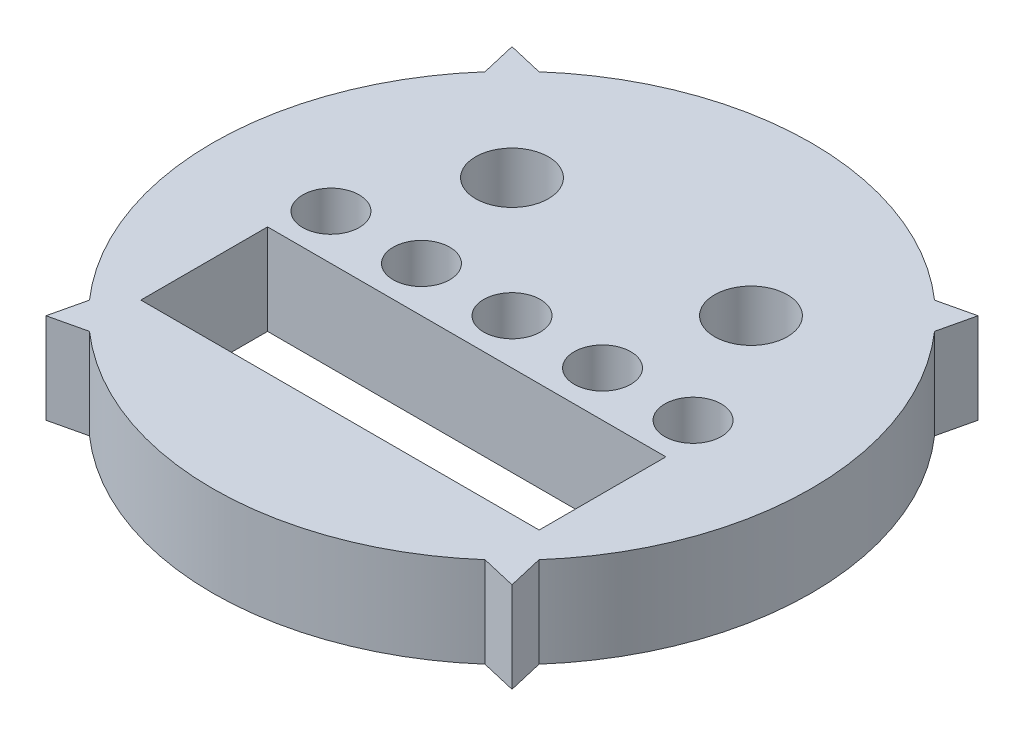
ISO-10303-21;
HEADER;
FILE_DESCRIPTION(('STEP AP214'),'2;1');
FILE_NAME('part.step','',(''),(''),'','','');
FILE_SCHEMA(('AUTOMOTIVE_DESIGN { 1 0 10303 214 1 1 1 1 }'));
ENDSEC;
DATA;
#1=APPLICATION_CONTEXT('core data for automotive mechanical design processes');
#2=APPLICATION_PROTOCOL_DEFINITION('international standard','automotive_design',2000,#1);
#3=PRODUCT_CONTEXT('',#1,'mechanical');
#4=PRODUCT('Part','Part','',(#3));
#5=PRODUCT_RELATED_PRODUCT_CATEGORY('part','',(#4));
#6=PRODUCT_DEFINITION_FORMATION('','',#4);
#7=PRODUCT_DEFINITION_CONTEXT('part definition',#1,'design');
#8=PRODUCT_DEFINITION('design','',#6,#7);
#9=PRODUCT_DEFINITION_SHAPE('','',#8);
#10=(LENGTH_UNIT() NAMED_UNIT(*) SI_UNIT(.MILLI.,.METRE.));
#11=(NAMED_UNIT(*) PLANE_ANGLE_UNIT() SI_UNIT($,.RADIAN.));
#12=(NAMED_UNIT(*) SI_UNIT($,.STERADIAN.) SOLID_ANGLE_UNIT());
#13=UNCERTAINTY_MEASURE_WITH_UNIT(LENGTH_MEASURE(1.E-05),#10,'distance_accuracy_value','');
#14=(GEOMETRIC_REPRESENTATION_CONTEXT(3) GLOBAL_UNCERTAINTY_ASSIGNED_CONTEXT((#13)) GLOBAL_UNIT_ASSIGNED_CONTEXT((#10,
#11,#12)) REPRESENTATION_CONTEXT('',''));
#15=CARTESIAN_POINT('',(0.,0.,0.));
#16=DIRECTION('',(0.,0.,1.));
#17=DIRECTION('',(1.,0.,0.));
#18=AXIS2_PLACEMENT_3D('',#15,#16,#17);
#19=CARTESIAN_POINT('',(0.,6.35,0.));
#20=DIRECTION('',(0.,1.,0.));
#21=DIRECTION('',(0.,0.,1.));
#22=AXIS2_PLACEMENT_3D('',#19,#20,#21);
#23=PLANE('',#22);
#24=CARTESIAN_POINT('',(8.382,6.35,-8.382));
#25=DIRECTION('',(0.,1.,0.));
#26=DIRECTION('',(0.,0.,1.));
#27=AXIS2_PLACEMENT_3D('',#24,#25,#26);
#28=CIRCLE('',#27,2.5527);
#29=CARTESIAN_POINT('',(8.382,6.35,-5.8293));
#30=VERTEX_POINT('',#29);
#31=EDGE_CURVE('E472',#30,#30,#28,.T.);
#32=ORIENTED_EDGE('',*,*,#31,.F.);
#33=EDGE_LOOP('',(#32));
#34=FACE_BOUND('',#33,.T.);
#35=CARTESIAN_POINT('',(-8.382,6.35,-8.382));
#36=DIRECTION('',(0.,1.,0.));
#37=DIRECTION('',(0.,0.,1.));
#38=AXIS2_PLACEMENT_3D('',#35,#36,#37);
#39=CIRCLE('',#38,2.5527);
#40=CARTESIAN_POINT('',(-8.382,6.35,-5.8293));
#41=VERTEX_POINT('',#40);
#42=EDGE_CURVE('E182',#41,#41,#39,.T.);
#43=ORIENTED_EDGE('',*,*,#42,.F.);
#44=EDGE_LOOP('',(#43));
#45=FACE_BOUND('',#44,.T.);
#46=CARTESIAN_POINT('',(-6.35,6.35,0.));
#47=DIRECTION('',(0.,1.,0.));
#48=DIRECTION('',(0.,0.,1.));
#49=AXIS2_PLACEMENT_3D('',#46,#47,#48);
#50=CIRCLE('',#49,1.984375);
#51=CARTESIAN_POINT('',(-6.35,6.35,1.984375));
#52=VERTEX_POINT('',#51);
#53=EDGE_CURVE('E213',#52,#52,#50,.T.);
#54=ORIENTED_EDGE('',*,*,#53,.F.);
#55=EDGE_LOOP('',(#54));
#56=FACE_BOUND('',#55,.T.);
#57=CARTESIAN_POINT('',(0.,6.35,0.));
#58=DIRECTION('',(0.,1.,0.));
#59=DIRECTION('',(0.,0.,1.));
#60=AXIS2_PLACEMENT_3D('',#57,#58,#59);
#61=CIRCLE('',#60,21.);
#62=CARTESIAN_POINT('',(13.8700852365894,6.35,-15.767711803865));
#63=VERTEX_POINT('',#62);
#64=CARTESIAN_POINT('',(-13.8700852365893,6.35,-15.7677118038652));
#65=VERTEX_POINT('',#64);
#66=EDGE_CURVE('E232',#63,#65,#61,.T.);
#67=ORIENTED_EDGE('',*,*,#66,.T.);
#68=DIRECTION('',(-0.973932989200464,0.,-0.22683591546986));
#69=VECTOR('',#68,1.);
#70=CARTESIAN_POINT('',(-16.3438750291584,6.35,-16.3438750291586));
#71=LINE('',#70,#69);
#72=CARTESIAN_POINT('',(-16.3438750291584,6.35,-16.3438750291586));
#73=VERTEX_POINT('',#72);
#74=EDGE_CURVE('E235',#65,#73,#71,.T.);
#75=ORIENTED_EDGE('',*,*,#74,.T.);
#76=DIRECTION('',(0.22683591546985,0.,0.973932989200466));
#77=VECTOR('',#76,1.);
#78=CARTESIAN_POINT('',(-15.767711803865,6.35,-13.8700852365894));
#79=LINE('',#78,#77);
#80=CARTESIAN_POINT('',(-15.767711803865,6.35,-13.8700852365894));
#81=VERTEX_POINT('',#80);
#82=EDGE_CURVE('E238',#73,#81,#79,.T.);
#83=ORIENTED_EDGE('',*,*,#82,.T.);
#84=CARTESIAN_POINT('',(0.,6.35,0.));
#85=DIRECTION('',(0.,1.,0.));
#86=DIRECTION('',(0.,0.,1.));
#87=AXIS2_PLACEMENT_3D('',#84,#85,#86);
#88=CIRCLE('',#87,21.);
#89=CARTESIAN_POINT('',(-15.7677118038652,6.35,13.8700852365893));
#90=VERTEX_POINT('',#89);
#91=EDGE_CURVE('E240',#81,#90,#88,.T.);
#92=ORIENTED_EDGE('',*,*,#91,.T.);
#93=DIRECTION('',(-0.226835915469858,0.,0.973932989200464));
#94=VECTOR('',#93,1.);
#95=CARTESIAN_POINT('',(-16.3438750291586,6.35,16.3438750291584));
#96=LINE('',#95,#94);
#97=CARTESIAN_POINT('',(-16.3438750291586,6.35,16.3438750291584));
#98=VERTEX_POINT('',#97);
#99=EDGE_CURVE('E242',#90,#98,#96,.T.);
#100=ORIENTED_EDGE('',*,*,#99,.T.);
#101=DIRECTION('',(0.973932989200466,0.,-0.22683591546985));
#102=VECTOR('',#101,1.);
#103=CARTESIAN_POINT('',(-13.8700852365894,6.35,15.767711803865));
#104=LINE('',#103,#102);
#105=CARTESIAN_POINT('',(-13.8700852365894,6.35,15.767711803865));
#106=VERTEX_POINT('',#105);
#107=EDGE_CURVE('E244',#98,#106,#104,.T.);
#108=ORIENTED_EDGE('',*,*,#107,.T.);
#109=CARTESIAN_POINT('',(0.,6.35,0.));
#110=DIRECTION('',(0.,1.,0.));
#111=DIRECTION('',(0.,0.,1.));
#112=AXIS2_PLACEMENT_3D('',#109,#110,#111);
#113=CIRCLE('',#112,21.);
#114=CARTESIAN_POINT('',(13.8700852365893,6.35,15.7677118038652));
#115=VERTEX_POINT('',#114);
#116=EDGE_CURVE('E246',#106,#115,#113,.T.);
#117=ORIENTED_EDGE('',*,*,#116,.T.);
#118=DIRECTION('',(0.973932989200464,0.,0.226835915469859));
#119=VECTOR('',#118,1.);
#120=CARTESIAN_POINT('',(16.3438750291584,6.35,16.3438750291586));
#121=LINE('',#120,#119);
#122=CARTESIAN_POINT('',(16.3438750291584,6.35,16.3438750291586));
#123=VERTEX_POINT('',#122);
#124=EDGE_CURVE('E248',#115,#123,#121,.T.);
#125=ORIENTED_EDGE('',*,*,#124,.T.);
#126=DIRECTION('',(-0.226835915469849,0.,-0.973932989200466));
#127=VECTOR('',#126,1.);
#128=CARTESIAN_POINT('',(15.767711803865,6.35,13.8700852365894));
#129=LINE('',#128,#127);
#130=CARTESIAN_POINT('',(15.767711803865,6.35,13.8700852365894));
#131=VERTEX_POINT('',#130);
#132=EDGE_CURVE('E250',#123,#131,#129,.T.);
#133=ORIENTED_EDGE('',*,*,#132,.T.);
#134=CARTESIAN_POINT('',(0.,6.35,0.));
#135=DIRECTION('',(0.,1.,0.));
#136=DIRECTION('',(0.,0.,1.));
#137=AXIS2_PLACEMENT_3D('',#134,#135,#136);
#138=CIRCLE('',#137,21.);
#139=CARTESIAN_POINT('',(15.7677118038652,6.35,-13.8700852365893));
#140=VERTEX_POINT('',#139);
#141=EDGE_CURVE('E252',#131,#140,#138,.T.);
#142=ORIENTED_EDGE('',*,*,#141,.T.);
#143=DIRECTION('',(0.226835915469859,0.,-0.973932989200464));
#144=VECTOR('',#143,1.);
#145=CARTESIAN_POINT('',(16.3438750291586,6.35,-16.3438750291584));
#146=LINE('',#145,#144);
#147=CARTESIAN_POINT('',(16.3438750291586,6.35,-16.3438750291584));
#148=VERTEX_POINT('',#147);
#149=EDGE_CURVE('E254',#140,#148,#146,.T.);
#150=ORIENTED_EDGE('',*,*,#149,.T.);
#151=DIRECTION('',(-0.973932989200466,0.,0.226835915469849));
#152=VECTOR('',#151,1.);
#153=CARTESIAN_POINT('',(13.8700852365894,6.35,-15.767711803865));
#154=LINE('',#153,#152);
#155=EDGE_CURVE('E256',#148,#63,#154,.T.);
#156=ORIENTED_EDGE('',*,*,#155,.T.);
#157=EDGE_LOOP('',(#67,#75,#83,#92,#100,#108,#117,#125,#133,#142,#150,#156));
#158=FACE_BOUND('',#157,.T.);
#159=CARTESIAN_POINT('',(-12.7,6.35,0.));
#160=DIRECTION('',(0.,1.,0.));
#161=DIRECTION('',(0.,0.,1.));
#162=AXIS2_PLACEMENT_3D('',#159,#160,#161);
#163=CIRCLE('',#162,1.984375);
#164=CARTESIAN_POINT('',(-12.7,6.35,1.984375));
#165=VERTEX_POINT('',#164);
#166=EDGE_CURVE('E224',#165,#165,#163,.T.);
#167=ORIENTED_EDGE('',*,*,#166,.F.);
#168=EDGE_LOOP('',(#167));
#169=FACE_BOUND('',#168,.T.);
#170=CARTESIAN_POINT('',(0.,6.35,0.));
#171=DIRECTION('',(0.,1.,0.));
#172=DIRECTION('',(0.,0.,1.));
#173=AXIS2_PLACEMENT_3D('',#170,#171,#172);
#174=CIRCLE('',#173,1.984375);
#175=CARTESIAN_POINT('',(0.,6.35,1.984375));
#176=VERTEX_POINT('',#175);
#177=EDGE_CURVE('E205',#176,#176,#174,.T.);
#178=ORIENTED_EDGE('',*,*,#177,.F.);
#179=EDGE_LOOP('',(#178));
#180=FACE_BOUND('',#179,.T.);
#181=DIRECTION('',(1.,0.,0.));
#182=VECTOR('',#181,1.);
#183=CARTESIAN_POINT('',(-13.97,6.35,12.065));
#184=LINE('',#183,#182);
#185=CARTESIAN_POINT('',(-13.97,6.35,12.065));
#186=VERTEX_POINT('',#185);
#187=CARTESIAN_POINT('',(13.97,6.35,12.065));
#188=VERTEX_POINT('',#187);
#189=EDGE_CURVE('E159',#186,#188,#184,.T.);
#190=ORIENTED_EDGE('',*,*,#189,.F.);
#191=DIRECTION('',(0.,0.,1.));
#192=VECTOR('',#191,1.);
#193=CARTESIAN_POINT('',(-13.97,6.35,3.175));
#194=LINE('',#193,#192);
#195=CARTESIAN_POINT('',(-13.97,6.35,3.175));
#196=VERTEX_POINT('',#195);
#197=EDGE_CURVE('E151',#196,#186,#194,.T.);
#198=ORIENTED_EDGE('',*,*,#197,.F.);
#199=DIRECTION('',(-1.,0.,0.));
#200=VECTOR('',#199,1.);
#201=CARTESIAN_POINT('',(-13.97,6.35,3.175));
#202=LINE('',#201,#200);
#203=CARTESIAN_POINT('',(13.97,6.35,3.175));
#204=VERTEX_POINT('',#203);
#205=EDGE_CURVE('E174',#204,#196,#202,.T.);
#206=ORIENTED_EDGE('',*,*,#205,.F.);
#207=DIRECTION('',(0.,0.,-1.));
#208=VECTOR('',#207,1.);
#209=CARTESIAN_POINT('',(13.97,6.35,3.175));
#210=LINE('',#209,#208);
#211=EDGE_CURVE('E172',#188,#204,#210,.T.);
#212=ORIENTED_EDGE('',*,*,#211,.F.);
#213=EDGE_LOOP('',(#190,#198,#206,#212));
#214=FACE_BOUND('',#213,.T.);
#215=CARTESIAN_POINT('',(6.35,6.35,0.));
#216=DIRECTION('',(0.,1.,0.));
#217=DIRECTION('',(0.,0.,1.));
#218=AXIS2_PLACEMENT_3D('',#215,#216,#217);
#219=CIRCLE('',#218,1.984375);
#220=CARTESIAN_POINT('',(6.35,6.35,1.984375));
#221=VERTEX_POINT('',#220);
#222=EDGE_CURVE('E479',#221,#221,#219,.T.);
#223=ORIENTED_EDGE('',*,*,#222,.F.);
#224=EDGE_LOOP('',(#223));
#225=FACE_BOUND('',#224,.T.);
#226=CARTESIAN_POINT('',(12.7,6.35,0.));
#227=DIRECTION('',(0.,1.,0.));
#228=DIRECTION('',(0.,0.,1.));
#229=AXIS2_PLACEMENT_3D('',#226,#227,#228);
#230=CIRCLE('',#229,1.984375);
#231=CARTESIAN_POINT('',(12.7,6.35,1.984375));
#232=VERTEX_POINT('',#231);
#233=EDGE_CURVE('E461',#232,#232,#230,.T.);
#234=ORIENTED_EDGE('',*,*,#233,.F.);
#235=EDGE_LOOP('',(#234));
#236=FACE_BOUND('',#235,.T.);
#237=ADVANCED_FACE('F38',(#34,#45,#56,#158,#169,#180,#214,#225,#236),#23,.T.);
#238=CARTESIAN_POINT('',(0.,0.,0.));
#239=DIRECTION('',(0.,1.,0.));
#240=DIRECTION('',(0.,0.,1.));
#241=AXIS2_PLACEMENT_3D('',#238,#239,#240);
#242=PLANE('',#241);
#243=CARTESIAN_POINT('',(0.,0.,0.));
#244=DIRECTION('',(0.,1.,0.));
#245=DIRECTION('',(0.,0.,1.));
#246=AXIS2_PLACEMENT_3D('',#243,#244,#245);
#247=CIRCLE('',#246,1.984375);
#248=CARTESIAN_POINT('',(0.,0.,1.984375));
#249=VERTEX_POINT('',#248);
#250=EDGE_CURVE('E167',#249,#249,#247,.T.);
#251=ORIENTED_EDGE('',*,*,#250,.T.);
#252=EDGE_LOOP('',(#251));
#253=FACE_BOUND('',#252,.T.);
#254=CARTESIAN_POINT('',(-6.35,0.,0.));
#255=DIRECTION('',(0.,1.,0.));
#256=DIRECTION('',(0.,0.,1.));
#257=AXIS2_PLACEMENT_3D('',#254,#255,#256);
#258=CIRCLE('',#257,1.984375);
#259=CARTESIAN_POINT('',(-6.35,0.,1.984375));
#260=VERTEX_POINT('',#259);
#261=EDGE_CURVE('E208',#260,#260,#258,.T.);
#262=ORIENTED_EDGE('',*,*,#261,.T.);
#263=EDGE_LOOP('',(#262));
#264=FACE_BOUND('',#263,.T.);
#265=CARTESIAN_POINT('',(-12.7,0.,0.));
#266=DIRECTION('',(0.,1.,0.));
#267=DIRECTION('',(0.,0.,1.));
#268=AXIS2_PLACEMENT_3D('',#265,#266,#267);
#269=CIRCLE('',#268,1.984375);
#270=CARTESIAN_POINT('',(-12.7,0.,1.984375));
#271=VERTEX_POINT('',#270);
#272=EDGE_CURVE('E227',#271,#271,#269,.T.);
#273=ORIENTED_EDGE('',*,*,#272,.T.);
#274=EDGE_LOOP('',(#273));
#275=FACE_BOUND('',#274,.T.);
#276=CARTESIAN_POINT('',(0.,0.,0.));
#277=DIRECTION('',(0.,1.,0.));
#278=DIRECTION('',(0.,0.,1.));
#279=AXIS2_PLACEMENT_3D('',#276,#277,#278);
#280=CIRCLE('',#279,21.);
#281=CARTESIAN_POINT('',(13.8700852365894,0.,-15.767711803865));
#282=VERTEX_POINT('',#281);
#283=CARTESIAN_POINT('',(-13.8700852365893,0.,-15.7677118038652));
#284=VERTEX_POINT('',#283);
#285=EDGE_CURVE('E226',#282,#284,#280,.T.);
#286=ORIENTED_EDGE('',*,*,#285,.F.);
#287=DIRECTION('',(-0.973932989200466,0.,0.226835915469849));
#288=VECTOR('',#287,1.);
#289=CARTESIAN_POINT('',(13.8700852365894,0.,-15.767711803865));
#290=LINE('',#289,#288);
#291=CARTESIAN_POINT('',(16.3438750291586,0.,-16.3438750291584));
#292=VERTEX_POINT('',#291);
#293=EDGE_CURVE('E236',#292,#282,#290,.T.);
#294=ORIENTED_EDGE('',*,*,#293,.F.);
#295=DIRECTION('',(0.226835915469859,0.,-0.973932989200464));
#296=VECTOR('',#295,1.);
#297=CARTESIAN_POINT('',(16.3438750291586,0.,-16.3438750291584));
#298=LINE('',#297,#296);
#299=CARTESIAN_POINT('',(15.7677118038652,0.,-13.8700852365893));
#300=VERTEX_POINT('',#299);
#301=EDGE_CURVE('E273',#300,#292,#298,.T.);
#302=ORIENTED_EDGE('',*,*,#301,.F.);
#303=CARTESIAN_POINT('',(0.,0.,0.));
#304=DIRECTION('',(0.,1.,0.));
#305=DIRECTION('',(0.,0.,1.));
#306=AXIS2_PLACEMENT_3D('',#303,#304,#305);
#307=CIRCLE('',#306,21.);
#308=CARTESIAN_POINT('',(15.767711803865,0.,13.8700852365894));
#309=VERTEX_POINT('',#308);
#310=EDGE_CURVE('E351',#309,#300,#307,.T.);
#311=ORIENTED_EDGE('',*,*,#310,.F.);
#312=DIRECTION('',(-0.226835915469849,0.,-0.973932989200466));
#313=VECTOR('',#312,1.);
#314=CARTESIAN_POINT('',(15.767711803865,0.,13.8700852365894));
#315=LINE('',#314,#313);
#316=CARTESIAN_POINT('',(16.3438750291584,0.,16.3438750291586));
#317=VERTEX_POINT('',#316);
#318=EDGE_CURVE('E348',#317,#309,#315,.T.);
#319=ORIENTED_EDGE('',*,*,#318,.F.);
#320=DIRECTION('',(0.973932989200464,0.,0.226835915469859));
#321=VECTOR('',#320,1.);
#322=CARTESIAN_POINT('',(16.3438750291584,0.,16.3438750291586));
#323=LINE('',#322,#321);
#324=CARTESIAN_POINT('',(13.8700852365893,0.,15.7677118038652));
#325=VERTEX_POINT('',#324);
#326=EDGE_CURVE('E343',#325,#317,#323,.T.);
#327=ORIENTED_EDGE('',*,*,#326,.F.);
#328=CARTESIAN_POINT('',(0.,0.,0.));
#329=DIRECTION('',(0.,1.,0.));
#330=DIRECTION('',(0.,0.,1.));
#331=AXIS2_PLACEMENT_3D('',#328,#329,#330);
#332=CIRCLE('',#331,21.);
#333=CARTESIAN_POINT('',(-13.8700852365894,0.,15.767711803865));
#334=VERTEX_POINT('',#333);
#335=EDGE_CURVE('E339',#334,#325,#332,.T.);
#336=ORIENTED_EDGE('',*,*,#335,.F.);
#337=DIRECTION('',(0.973932989200466,0.,-0.22683591546985));
#338=VECTOR('',#337,1.);
#339=CARTESIAN_POINT('',(-13.8700852365894,0.,15.767711803865));
#340=LINE('',#339,#338);
#341=CARTESIAN_POINT('',(-16.3438750291586,0.,16.3438750291584));
#342=VERTEX_POINT('',#341);
#343=EDGE_CURVE('E335',#342,#334,#340,.T.);
#344=ORIENTED_EDGE('',*,*,#343,.F.);
#345=DIRECTION('',(-0.226835915469858,0.,0.973932989200464));
#346=VECTOR('',#345,1.);
#347=CARTESIAN_POINT('',(-16.3438750291586,0.,16.3438750291584));
#348=LINE('',#347,#346);
#349=CARTESIAN_POINT('',(-15.7677118038652,0.,13.8700852365893));
#350=VERTEX_POINT('',#349);
#351=EDGE_CURVE('E323',#350,#342,#348,.T.);
#352=ORIENTED_EDGE('',*,*,#351,.F.);
#353=CARTESIAN_POINT('',(0.,0.,0.));
#354=DIRECTION('',(0.,1.,0.));
#355=DIRECTION('',(0.,0.,1.));
#356=AXIS2_PLACEMENT_3D('',#353,#354,#355);
#357=CIRCLE('',#356,21.);
#358=CARTESIAN_POINT('',(-15.767711803865,0.,-13.8700852365894));
#359=VERTEX_POINT('',#358);
#360=EDGE_CURVE('E319',#359,#350,#357,.T.);
#361=ORIENTED_EDGE('',*,*,#360,.F.);
#362=DIRECTION('',(0.22683591546985,0.,0.973932989200466));
#363=VECTOR('',#362,1.);
#364=CARTESIAN_POINT('',(-15.767711803865,0.,-13.8700852365894));
#365=LINE('',#364,#363);
#366=CARTESIAN_POINT('',(-16.3438750291584,0.,-16.3438750291586));
#367=VERTEX_POINT('',#366);
#368=EDGE_CURVE('E311',#367,#359,#365,.T.);
#369=ORIENTED_EDGE('',*,*,#368,.F.);
#370=DIRECTION('',(-0.973932989200464,0.,-0.22683591546986));
#371=VECTOR('',#370,1.);
#372=CARTESIAN_POINT('',(-16.3438750291584,0.,-16.3438750291586));
#373=LINE('',#372,#371);
#374=EDGE_CURVE('E262',#284,#367,#373,.T.);
#375=ORIENTED_EDGE('',*,*,#374,.F.);
#376=EDGE_LOOP('',(#286,#294,#302,#311,#319,#327,#336,#344,#352,#361,#369,#375));
#377=FACE_BOUND('',#376,.T.);
#378=DIRECTION('',(0.,0.,1.));
#379=VECTOR('',#378,1.);
#380=CARTESIAN_POINT('',(-13.97,0.,3.175));
#381=LINE('',#380,#379);
#382=CARTESIAN_POINT('',(-13.97,0.,3.175));
#383=VERTEX_POINT('',#382);
#384=CARTESIAN_POINT('',(-13.97,0.,12.065));
#385=VERTEX_POINT('',#384);
#386=EDGE_CURVE('E61',#383,#385,#381,.T.);
#387=ORIENTED_EDGE('',*,*,#386,.T.);
#388=DIRECTION('',(1.,0.,0.));
#389=VECTOR('',#388,1.);
#390=CARTESIAN_POINT('',(-13.97,0.,12.065));
#391=LINE('',#390,#389);
#392=CARTESIAN_POINT('',(13.97,0.,12.065));
#393=VERTEX_POINT('',#392);
#394=EDGE_CURVE('E166',#385,#393,#391,.T.);
#395=ORIENTED_EDGE('',*,*,#394,.T.);
#396=DIRECTION('',(0.,0.,-1.));
#397=VECTOR('',#396,1.);
#398=CARTESIAN_POINT('',(13.97,0.,3.175));
#399=LINE('',#398,#397);
#400=CARTESIAN_POINT('',(13.97,0.,3.175));
#401=VERTEX_POINT('',#400);
#402=EDGE_CURVE('E194',#393,#401,#399,.T.);
#403=ORIENTED_EDGE('',*,*,#402,.T.);
#404=DIRECTION('',(-1.,0.,0.));
#405=VECTOR('',#404,1.);
#406=CARTESIAN_POINT('',(-13.97,0.,3.175));
#407=LINE('',#406,#405);
#408=EDGE_CURVE('E160',#401,#383,#407,.T.);
#409=ORIENTED_EDGE('',*,*,#408,.T.);
#410=EDGE_LOOP('',(#387,#395,#403,#409));
#411=FACE_BOUND('',#410,.T.);
#412=CARTESIAN_POINT('',(-8.382,0.,-8.382));
#413=DIRECTION('',(0.,1.,0.));
#414=DIRECTION('',(0.,0.,1.));
#415=AXIS2_PLACEMENT_3D('',#412,#413,#414);
#416=CIRCLE('',#415,2.5527);
#417=CARTESIAN_POINT('',(-8.382,0.,-5.8293));
#418=VERTEX_POINT('',#417);
#419=EDGE_CURVE('E487',#418,#418,#416,.T.);
#420=ORIENTED_EDGE('',*,*,#419,.T.);
#421=EDGE_LOOP('',(#420));
#422=FACE_BOUND('',#421,.T.);
#423=CARTESIAN_POINT('',(6.35,0.,0.));
#424=DIRECTION('',(0.,1.,0.));
#425=DIRECTION('',(0.,0.,1.));
#426=AXIS2_PLACEMENT_3D('',#423,#424,#425);
#427=CIRCLE('',#426,1.984375);
#428=CARTESIAN_POINT('',(6.35,0.,1.984375));
#429=VERTEX_POINT('',#428);
#430=EDGE_CURVE('E475',#429,#429,#427,.T.);
#431=ORIENTED_EDGE('',*,*,#430,.T.);
#432=EDGE_LOOP('',(#431));
#433=FACE_BOUND('',#432,.T.);
#434=CARTESIAN_POINT('',(8.382,0.,-8.382));
#435=DIRECTION('',(0.,1.,0.));
#436=DIRECTION('',(0.,0.,1.));
#437=AXIS2_PLACEMENT_3D('',#434,#435,#436);
#438=CIRCLE('',#437,2.5527);
#439=CARTESIAN_POINT('',(8.382,0.,-5.8293));
#440=VERTEX_POINT('',#439);
#441=EDGE_CURVE('E468',#440,#440,#438,.T.);
#442=ORIENTED_EDGE('',*,*,#441,.T.);
#443=EDGE_LOOP('',(#442));
#444=FACE_BOUND('',#443,.T.);
#445=CARTESIAN_POINT('',(12.7,0.,0.));
#446=DIRECTION('',(0.,1.,0.));
#447=DIRECTION('',(0.,0.,1.));
#448=AXIS2_PLACEMENT_3D('',#445,#446,#447);
#449=CIRCLE('',#448,1.984375);
#450=CARTESIAN_POINT('',(12.7,0.,1.984375));
#451=VERTEX_POINT('',#450);
#452=EDGE_CURVE('E464',#451,#451,#449,.T.);
#453=ORIENTED_EDGE('',*,*,#452,.T.);
#454=EDGE_LOOP('',(#453));
#455=FACE_BOUND('',#454,.T.);
#456=ADVANCED_FACE('F316',(#253,#264,#275,#377,#411,#422,#433,#444,#455),#242,.F.);
#457=CARTESIAN_POINT('',(0.,6.35,0.));
#458=DIRECTION('',(0.,-1.,0.));
#459=DIRECTION('',(0.,0.,-1.));
#460=AXIS2_PLACEMENT_3D('',#457,#458,#459);
#461=CYLINDRICAL_SURFACE('',#460,21.);
#462=ORIENTED_EDGE('',*,*,#285,.T.);
#463=DIRECTION('',(0.,-1.,0.));
#464=VECTOR('',#463,1.);
#465=CARTESIAN_POINT('',(-13.8700852365893,6.35,-15.7677118038652));
#466=LINE('',#465,#464);
#467=EDGE_CURVE('E12',#65,#284,#466,.T.);
#468=ORIENTED_EDGE('',*,*,#467,.F.);
#469=ORIENTED_EDGE('',*,*,#66,.F.);
#470=DIRECTION('',(0.,-1.,0.));
#471=VECTOR('',#470,1.);
#472=CARTESIAN_POINT('',(13.8700852365894,6.35,-15.767711803865));
#473=LINE('',#472,#471);
#474=EDGE_CURVE('E258',#63,#282,#473,.T.);
#475=ORIENTED_EDGE('',*,*,#474,.T.);
#476=EDGE_LOOP('',(#462,#468,#469,#475));
#477=FACE_BOUND('',#476,.T.);
#478=ADVANCED_FACE('F40',(#477),#461,.T.);
#479=CARTESIAN_POINT('',(-16.3438750291584,6.35,-16.3438750291586));
#480=DIRECTION('',(-0.22683591546986,0.,0.973932989200464));
#481=DIRECTION('',(0.973932989200464,0.,0.22683591546986));
#482=AXIS2_PLACEMENT_3D('',#479,#480,#481);
#483=PLANE('',#482);
#484=ORIENTED_EDGE('',*,*,#374,.T.);
#485=DIRECTION('',(0.,-1.,0.));
#486=VECTOR('',#485,1.);
#487=CARTESIAN_POINT('',(-16.3438750291584,6.35,-16.3438750291586));
#488=LINE('',#487,#486);
#489=EDGE_CURVE('E46',#73,#367,#488,.T.);
#490=ORIENTED_EDGE('',*,*,#489,.F.);
#491=ORIENTED_EDGE('',*,*,#74,.F.);
#492=ORIENTED_EDGE('',*,*,#467,.T.);
#493=EDGE_LOOP('',(#484,#490,#491,#492));
#494=FACE_BOUND('',#493,.T.);
#495=ADVANCED_FACE('F629',(#494),#483,.F.);
#496=CARTESIAN_POINT('',(-15.767711803865,6.35,-13.8700852365894));
#497=DIRECTION('',(0.973932989200466,0.,-0.22683591546985));
#498=DIRECTION('',(-0.22683591546985,0.,-0.973932989200466));
#499=AXIS2_PLACEMENT_3D('',#496,#497,#498);
#500=PLANE('',#499);
#501=ORIENTED_EDGE('',*,*,#368,.T.);
#502=DIRECTION('',(0.,-1.,0.));
#503=VECTOR('',#502,1.);
#504=CARTESIAN_POINT('',(-15.767711803865,6.35,-13.8700852365894));
#505=LINE('',#504,#503);
#506=EDGE_CURVE('E302',#81,#359,#505,.T.);
#507=ORIENTED_EDGE('',*,*,#506,.F.);
#508=ORIENTED_EDGE('',*,*,#82,.F.);
#509=ORIENTED_EDGE('',*,*,#489,.T.);
#510=EDGE_LOOP('',(#501,#507,#508,#509));
#511=FACE_BOUND('',#510,.T.);
#512=ADVANCED_FACE('F309',(#511),#500,.F.);
#513=CARTESIAN_POINT('',(0.,6.35,0.));
#514=DIRECTION('',(0.,-1.,0.));
#515=DIRECTION('',(0.,0.,-1.));
#516=AXIS2_PLACEMENT_3D('',#513,#514,#515);
#517=CYLINDRICAL_SURFACE('',#516,21.);
#518=ORIENTED_EDGE('',*,*,#360,.T.);
#519=DIRECTION('',(0.,-1.,0.));
#520=VECTOR('',#519,1.);
#521=CARTESIAN_POINT('',(-15.7677118038652,6.35,13.8700852365893));
#522=LINE('',#521,#520);
#523=EDGE_CURVE('E299',#90,#350,#522,.T.);
#524=ORIENTED_EDGE('',*,*,#523,.F.);
#525=ORIENTED_EDGE('',*,*,#91,.F.);
#526=ORIENTED_EDGE('',*,*,#506,.T.);
#527=EDGE_LOOP('',(#518,#524,#525,#526));
#528=FACE_BOUND('',#527,.T.);
#529=ADVANCED_FACE('F610',(#528),#517,.T.);
#530=CARTESIAN_POINT('',(-16.3438750291586,6.35,16.3438750291584));
#531=DIRECTION('',(0.973932989200464,0.,0.226835915469858));
#532=DIRECTION('',(0.226835915469858,0.,-0.973932989200464));
#533=AXIS2_PLACEMENT_3D('',#530,#531,#532);
#534=PLANE('',#533);
#535=ORIENTED_EDGE('',*,*,#351,.T.);
#536=DIRECTION('',(0.,-1.,0.));
#537=VECTOR('',#536,1.);
#538=CARTESIAN_POINT('',(-16.3438750291586,6.35,16.3438750291584));
#539=LINE('',#538,#537);
#540=EDGE_CURVE('E296',#98,#342,#539,.T.);
#541=ORIENTED_EDGE('',*,*,#540,.F.);
#542=ORIENTED_EDGE('',*,*,#99,.F.);
#543=ORIENTED_EDGE('',*,*,#523,.T.);
#544=EDGE_LOOP('',(#535,#541,#542,#543));
#545=FACE_BOUND('',#544,.T.);
#546=ADVANCED_FACE('F600',(#545),#534,.F.);
#547=CARTESIAN_POINT('',(-13.8700852365894,6.35,15.767711803865));
#548=DIRECTION('',(-0.22683591546985,0.,-0.973932989200466));
#549=DIRECTION('',(-0.973932989200466,0.,0.22683591546985));
#550=AXIS2_PLACEMENT_3D('',#547,#548,#549);
#551=PLANE('',#550);
#552=ORIENTED_EDGE('',*,*,#343,.T.);
#553=DIRECTION('',(0.,-1.,0.));
#554=VECTOR('',#553,1.);
#555=CARTESIAN_POINT('',(-13.8700852365894,6.35,15.767711803865));
#556=LINE('',#555,#554);
#557=EDGE_CURVE('E293',#106,#334,#556,.T.);
#558=ORIENTED_EDGE('',*,*,#557,.F.);
#559=ORIENTED_EDGE('',*,*,#107,.F.);
#560=ORIENTED_EDGE('',*,*,#540,.T.);
#561=EDGE_LOOP('',(#552,#558,#559,#560));
#562=FACE_BOUND('',#561,.T.);
#563=ADVANCED_FACE('F590',(#562),#551,.F.);
#564=CARTESIAN_POINT('',(0.,6.35,0.));
#565=DIRECTION('',(0.,-1.,0.));
#566=DIRECTION('',(0.,0.,-1.));
#567=AXIS2_PLACEMENT_3D('',#564,#565,#566);
#568=CYLINDRICAL_SURFACE('',#567,21.);
#569=ORIENTED_EDGE('',*,*,#335,.T.);
#570=DIRECTION('',(0.,-1.,0.));
#571=VECTOR('',#570,1.);
#572=CARTESIAN_POINT('',(13.8700852365893,6.35,15.7677118038652));
#573=LINE('',#572,#571);
#574=EDGE_CURVE('E290',#115,#325,#573,.T.);
#575=ORIENTED_EDGE('',*,*,#574,.F.);
#576=ORIENTED_EDGE('',*,*,#116,.F.);
#577=ORIENTED_EDGE('',*,*,#557,.T.);
#578=EDGE_LOOP('',(#569,#575,#576,#577));
#579=FACE_BOUND('',#578,.T.);
#580=ADVANCED_FACE('F580',(#579),#568,.T.);
#581=CARTESIAN_POINT('',(16.3438750291584,6.35,16.3438750291586));
#582=DIRECTION('',(0.226835915469859,0.,-0.973932989200464));
#583=DIRECTION('',(-0.973932989200464,0.,-0.226835915469859));
#584=AXIS2_PLACEMENT_3D('',#581,#582,#583);
#585=PLANE('',#584);
#586=ORIENTED_EDGE('',*,*,#326,.T.);
#587=DIRECTION('',(0.,-1.,0.));
#588=VECTOR('',#587,1.);
#589=CARTESIAN_POINT('',(16.3438750291584,6.35,16.3438750291586));
#590=LINE('',#589,#588);
#591=EDGE_CURVE('E287',#123,#317,#590,.T.);
#592=ORIENTED_EDGE('',*,*,#591,.F.);
#593=ORIENTED_EDGE('',*,*,#124,.F.);
#594=ORIENTED_EDGE('',*,*,#574,.T.);
#595=EDGE_LOOP('',(#586,#592,#593,#594));
#596=FACE_BOUND('',#595,.T.);
#597=ADVANCED_FACE('F385',(#596),#585,.F.);
#598=CARTESIAN_POINT('',(15.767711803865,6.35,13.8700852365894));
#599=DIRECTION('',(-0.973932989200466,0.,0.226835915469849));
#600=DIRECTION('',(0.226835915469849,0.,0.973932989200466));
#601=AXIS2_PLACEMENT_3D('',#598,#599,#600);
#602=PLANE('',#601);
#603=ORIENTED_EDGE('',*,*,#318,.T.);
#604=DIRECTION('',(0.,-1.,0.));
#605=VECTOR('',#604,1.);
#606=CARTESIAN_POINT('',(15.767711803865,6.35,13.8700852365894));
#607=LINE('',#606,#605);
#608=EDGE_CURVE('E284',#131,#309,#607,.T.);
#609=ORIENTED_EDGE('',*,*,#608,.F.);
#610=ORIENTED_EDGE('',*,*,#132,.F.);
#611=ORIENTED_EDGE('',*,*,#591,.T.);
#612=EDGE_LOOP('',(#603,#609,#610,#611));
#613=FACE_BOUND('',#612,.T.);
#614=ADVANCED_FACE('F378',(#613),#602,.F.);
#615=CARTESIAN_POINT('',(0.,6.35,0.));
#616=DIRECTION('',(0.,-1.,0.));
#617=DIRECTION('',(0.,0.,-1.));
#618=AXIS2_PLACEMENT_3D('',#615,#616,#617);
#619=CYLINDRICAL_SURFACE('',#618,21.);
#620=ORIENTED_EDGE('',*,*,#310,.T.);
#621=DIRECTION('',(0.,-1.,0.));
#622=VECTOR('',#621,1.);
#623=CARTESIAN_POINT('',(15.7677118038652,6.35,-13.8700852365893));
#624=LINE('',#623,#622);
#625=EDGE_CURVE('E281',#140,#300,#624,.T.);
#626=ORIENTED_EDGE('',*,*,#625,.F.);
#627=ORIENTED_EDGE('',*,*,#141,.F.);
#628=ORIENTED_EDGE('',*,*,#608,.T.);
#629=EDGE_LOOP('',(#620,#626,#627,#628));
#630=FACE_BOUND('',#629,.T.);
#631=ADVANCED_FACE('F376',(#630),#619,.T.);
#632=CARTESIAN_POINT('',(16.3438750291586,6.35,-16.3438750291584));
#633=DIRECTION('',(-0.973932989200464,0.,-0.226835915469859));
#634=DIRECTION('',(-0.226835915469859,0.,0.973932989200464));
#635=AXIS2_PLACEMENT_3D('',#632,#633,#634);
#636=PLANE('',#635);
#637=ORIENTED_EDGE('',*,*,#301,.T.);
#638=DIRECTION('',(0.,-1.,0.));
#639=VECTOR('',#638,1.);
#640=CARTESIAN_POINT('',(16.3438750291586,6.35,-16.3438750291584));
#641=LINE('',#640,#639);
#642=EDGE_CURVE('E278',#148,#292,#641,.T.);
#643=ORIENTED_EDGE('',*,*,#642,.F.);
#644=ORIENTED_EDGE('',*,*,#149,.F.);
#645=ORIENTED_EDGE('',*,*,#625,.T.);
#646=EDGE_LOOP('',(#637,#643,#644,#645));
#647=FACE_BOUND('',#646,.T.);
#648=ADVANCED_FACE('F361',(#647),#636,.F.);
#649=CARTESIAN_POINT('',(13.8700852365894,6.35,-15.767711803865));
#650=DIRECTION('',(0.226835915469849,0.,0.973932989200466));
#651=DIRECTION('',(0.973932989200466,0.,-0.226835915469849));
#652=AXIS2_PLACEMENT_3D('',#649,#650,#651);
#653=PLANE('',#652);
#654=ORIENTED_EDGE('',*,*,#293,.T.);
#655=ORIENTED_EDGE('',*,*,#474,.F.);
#656=ORIENTED_EDGE('',*,*,#155,.F.);
#657=ORIENTED_EDGE('',*,*,#642,.T.);
#658=EDGE_LOOP('',(#654,#655,#656,#657));
#659=FACE_BOUND('',#658,.T.);
#660=ADVANCED_FACE('F366',(#659),#653,.F.);
#661=CARTESIAN_POINT('',(-12.7,6.35,0.));
#662=DIRECTION('',(0.,-1.,0.));
#663=DIRECTION('',(0.,0.,-1.));
#664=AXIS2_PLACEMENT_3D('',#661,#662,#663);
#665=CYLINDRICAL_SURFACE('',#664,1.984375);
#666=ORIENTED_EDGE('',*,*,#166,.T.);
#667=EDGE_LOOP('',(#666));
#668=FACE_BOUND('',#667,.T.);
#669=ORIENTED_EDGE('',*,*,#272,.F.);
#670=EDGE_LOOP('',(#669));
#671=FACE_BOUND('',#670,.T.);
#672=ADVANCED_FACE('F399',(#668,#671),#665,.F.);
#673=CARTESIAN_POINT('',(-6.35,6.35,0.));
#674=DIRECTION('',(0.,-1.,0.));
#675=DIRECTION('',(0.,0.,-1.));
#676=AXIS2_PLACEMENT_3D('',#673,#674,#675);
#677=CYLINDRICAL_SURFACE('',#676,1.984375);
#678=ORIENTED_EDGE('',*,*,#53,.T.);
#679=EDGE_LOOP('',(#678));
#680=FACE_BOUND('',#679,.T.);
#681=ORIENTED_EDGE('',*,*,#261,.F.);
#682=EDGE_LOOP('',(#681));
#683=FACE_BOUND('',#682,.T.);
#684=ADVANCED_FACE('F406',(#680,#683),#677,.F.);
#685=CARTESIAN_POINT('',(0.,6.35,0.));
#686=DIRECTION('',(0.,-1.,0.));
#687=DIRECTION('',(0.,0.,-1.));
#688=AXIS2_PLACEMENT_3D('',#685,#686,#687);
#689=CYLINDRICAL_SURFACE('',#688,1.984375);
#690=ORIENTED_EDGE('',*,*,#177,.T.);
#691=EDGE_LOOP('',(#690));
#692=FACE_BOUND('',#691,.T.);
#693=ORIENTED_EDGE('',*,*,#250,.F.);
#694=EDGE_LOOP('',(#693));
#695=FACE_BOUND('',#694,.T.);
#696=ADVANCED_FACE('F411',(#692,#695),#689,.F.);
#697=CARTESIAN_POINT('',(-13.97,6.35,3.175));
#698=DIRECTION('',(1.,0.,0.));
#699=DIRECTION('',(0.,0.,-1.));
#700=AXIS2_PLACEMENT_3D('',#697,#698,#699);
#701=PLANE('',#700);
#702=ORIENTED_EDGE('',*,*,#386,.F.);
#703=DIRECTION('',(0.,-1.,0.));
#704=VECTOR('',#703,1.);
#705=CARTESIAN_POINT('',(-13.97,6.35,3.175));
#706=LINE('',#705,#704);
#707=EDGE_CURVE('E155',#196,#383,#706,.T.);
#708=ORIENTED_EDGE('',*,*,#707,.F.);
#709=ORIENTED_EDGE('',*,*,#197,.T.);
#710=DIRECTION('',(0.,-1.,0.));
#711=VECTOR('',#710,1.);
#712=CARTESIAN_POINT('',(-13.97,6.35,12.065));
#713=LINE('',#712,#711);
#714=EDGE_CURVE('E154',#186,#385,#713,.T.);
#715=ORIENTED_EDGE('',*,*,#714,.T.);
#716=EDGE_LOOP('',(#702,#708,#709,#715));
#717=FACE_BOUND('',#716,.T.);
#718=ADVANCED_FACE('F153',(#717),#701,.T.);
#719=CARTESIAN_POINT('',(-13.97,6.35,12.065));
#720=DIRECTION('',(0.,0.,-1.));
#721=DIRECTION('',(-1.,0.,0.));
#722=AXIS2_PLACEMENT_3D('',#719,#720,#721);
#723=PLANE('',#722);
#724=ORIENTED_EDGE('',*,*,#394,.F.);
#725=ORIENTED_EDGE('',*,*,#714,.F.);
#726=ORIENTED_EDGE('',*,*,#189,.T.);
#727=DIRECTION('',(0.,-1.,0.));
#728=VECTOR('',#727,1.);
#729=CARTESIAN_POINT('',(13.97,6.35,12.065));
#730=LINE('',#729,#728);
#731=EDGE_CURVE('E168',#188,#393,#730,.T.);
#732=ORIENTED_EDGE('',*,*,#731,.T.);
#733=EDGE_LOOP('',(#724,#725,#726,#732));
#734=FACE_BOUND('',#733,.T.);
#735=ADVANCED_FACE('F163',(#734),#723,.T.);
#736=CARTESIAN_POINT('',(13.97,6.35,3.175));
#737=DIRECTION('',(-1.,0.,0.));
#738=DIRECTION('',(0.,0.,1.));
#739=AXIS2_PLACEMENT_3D('',#736,#737,#738);
#740=PLANE('',#739);
#741=ORIENTED_EDGE('',*,*,#402,.F.);
#742=ORIENTED_EDGE('',*,*,#731,.F.);
#743=ORIENTED_EDGE('',*,*,#211,.T.);
#744=DIRECTION('',(0.,-1.,0.));
#745=VECTOR('',#744,1.);
#746=CARTESIAN_POINT('',(13.97,6.35,3.175));
#747=LINE('',#746,#745);
#748=EDGE_CURVE('E53',#204,#401,#747,.T.);
#749=ORIENTED_EDGE('',*,*,#748,.T.);
#750=EDGE_LOOP('',(#741,#742,#743,#749));
#751=FACE_BOUND('',#750,.T.);
#752=ADVANCED_FACE('F434',(#751),#740,.T.);
#753=CARTESIAN_POINT('',(-13.97,6.35,3.175));
#754=DIRECTION('',(0.,0.,1.));
#755=DIRECTION('',(1.,0.,0.));
#756=AXIS2_PLACEMENT_3D('',#753,#754,#755);
#757=PLANE('',#756);
#758=ORIENTED_EDGE('',*,*,#408,.F.);
#759=ORIENTED_EDGE('',*,*,#748,.F.);
#760=ORIENTED_EDGE('',*,*,#205,.T.);
#761=ORIENTED_EDGE('',*,*,#707,.T.);
#762=EDGE_LOOP('',(#758,#759,#760,#761));
#763=FACE_BOUND('',#762,.T.);
#764=ADVANCED_FACE('F437',(#763),#757,.T.);
#765=CARTESIAN_POINT('',(-8.382,6.35,-8.382));
#766=DIRECTION('',(0.,-1.,0.));
#767=DIRECTION('',(0.,0.,-1.));
#768=AXIS2_PLACEMENT_3D('',#765,#766,#767);
#769=CYLINDRICAL_SURFACE('',#768,2.5527);
#770=ORIENTED_EDGE('',*,*,#42,.T.);
#771=EDGE_LOOP('',(#770));
#772=FACE_BOUND('',#771,.T.);
#773=ORIENTED_EDGE('',*,*,#419,.F.);
#774=EDGE_LOOP('',(#773));
#775=FACE_BOUND('',#774,.T.);
#776=ADVANCED_FACE('F441',(#772,#775),#769,.F.);
#777=CARTESIAN_POINT('',(6.35,6.35,0.));
#778=DIRECTION('',(0.,-1.,0.));
#779=DIRECTION('',(0.,0.,-1.));
#780=AXIS2_PLACEMENT_3D('',#777,#778,#779);
#781=CYLINDRICAL_SURFACE('',#780,1.984375);
#782=ORIENTED_EDGE('',*,*,#222,.T.);
#783=EDGE_LOOP('',(#782));
#784=FACE_BOUND('',#783,.T.);
#785=ORIENTED_EDGE('',*,*,#430,.F.);
#786=EDGE_LOOP('',(#785));
#787=FACE_BOUND('',#786,.T.);
#788=ADVANCED_FACE('F444',(#784,#787),#781,.F.);
#789=CARTESIAN_POINT('',(8.382,6.35,-8.382));
#790=DIRECTION('',(0.,-1.,0.));
#791=DIRECTION('',(0.,0.,-1.));
#792=AXIS2_PLACEMENT_3D('',#789,#790,#791);
#793=CYLINDRICAL_SURFACE('',#792,2.5527);
#794=ORIENTED_EDGE('',*,*,#31,.T.);
#795=EDGE_LOOP('',(#794));
#796=FACE_BOUND('',#795,.T.);
#797=ORIENTED_EDGE('',*,*,#441,.F.);
#798=EDGE_LOOP('',(#797));
#799=FACE_BOUND('',#798,.T.);
#800=ADVANCED_FACE('F448',(#796,#799),#793,.F.);
#801=CARTESIAN_POINT('',(12.7,6.35,0.));
#802=DIRECTION('',(0.,-1.,0.));
#803=DIRECTION('',(0.,0.,-1.));
#804=AXIS2_PLACEMENT_3D('',#801,#802,#803);
#805=CYLINDRICAL_SURFACE('',#804,1.984375);
#806=ORIENTED_EDGE('',*,*,#233,.T.);
#807=EDGE_LOOP('',(#806));
#808=FACE_BOUND('',#807,.T.);
#809=ORIENTED_EDGE('',*,*,#452,.F.);
#810=EDGE_LOOP('',(#809));
#811=FACE_BOUND('',#810,.T.);
#812=ADVANCED_FACE('F452',(#808,#811),#805,.F.);
#813=CLOSED_SHELL('',(#237,#456,#478,#495,#512,#529,#546,#563,#580,#597,#614,#631,#648,#660,
#672,#684,#696,#718,#735,#752,#764,#776,#788,#800,#812));
#814=MANIFOLD_SOLID_BREP('B2',#813);
#815=ADVANCED_BREP_SHAPE_REPRESENTATION('',(#18,#814),#14);
#816=SHAPE_DEFINITION_REPRESENTATION(#9,#815);
ENDSEC;
END-ISO-10303-21;
